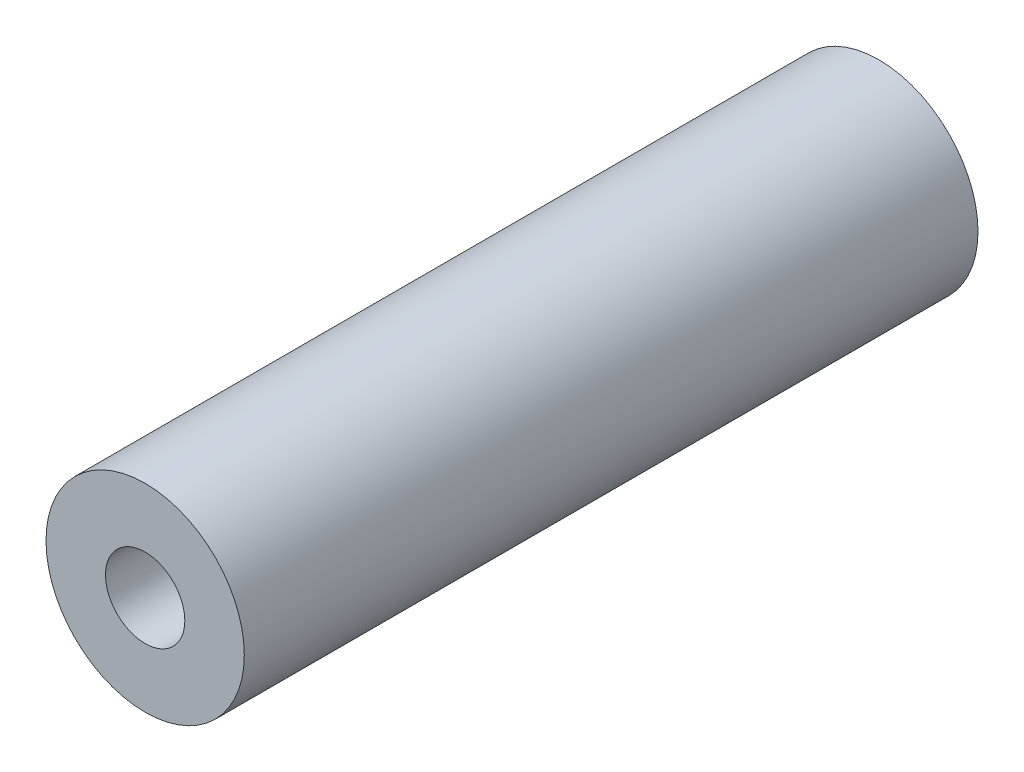
ISO-10303-21;
HEADER;
FILE_DESCRIPTION(('STEP AP214'),'2;1');
FILE_NAME('part.step','',(''),(''),'','','');
FILE_SCHEMA(('AUTOMOTIVE_DESIGN { 1 0 10303 214 1 1 1 1 }'));
ENDSEC;
DATA;
#1=APPLICATION_CONTEXT('core data for automotive mechanical design processes');
#2=APPLICATION_PROTOCOL_DEFINITION('international standard','automotive_design',2000,#1);
#3=PRODUCT_CONTEXT('',#1,'mechanical');
#4=PRODUCT('Part','Part','',(#3));
#5=PRODUCT_RELATED_PRODUCT_CATEGORY('part','',(#4));
#6=PRODUCT_DEFINITION_FORMATION('','',#4);
#7=PRODUCT_DEFINITION_CONTEXT('part definition',#1,'design');
#8=PRODUCT_DEFINITION('design','',#6,#7);
#9=PRODUCT_DEFINITION_SHAPE('','',#8);
#10=(LENGTH_UNIT() NAMED_UNIT(*) SI_UNIT(.MILLI.,.METRE.));
#11=(NAMED_UNIT(*) PLANE_ANGLE_UNIT() SI_UNIT($,.RADIAN.));
#12=(NAMED_UNIT(*) SI_UNIT($,.STERADIAN.) SOLID_ANGLE_UNIT());
#13=UNCERTAINTY_MEASURE_WITH_UNIT(LENGTH_MEASURE(1.E-05),#10,'distance_accuracy_value','');
#14=(GEOMETRIC_REPRESENTATION_CONTEXT(3) GLOBAL_UNCERTAINTY_ASSIGNED_CONTEXT((#13)) GLOBAL_UNIT_ASSIGNED_CONTEXT((#10,
#11,#12)) REPRESENTATION_CONTEXT('',''));
#15=CARTESIAN_POINT('',(0.,0.,0.));
#16=DIRECTION('',(0.,0.,1.));
#17=DIRECTION('',(1.,0.,0.));
#18=AXIS2_PLACEMENT_3D('',#15,#16,#17);
#19=CARTESIAN_POINT('',(0.,0.,37.));
#20=DIRECTION('',(0.,0.,-1.));
#21=DIRECTION('',(-1.,0.,0.));
#22=AXIS2_PLACEMENT_3D('',#19,#20,#21);
#23=CYLINDRICAL_SURFACE('',#22,5.);
#24=CARTESIAN_POINT('',(0.,0.,37.));
#25=DIRECTION('',(0.,0.,1.));
#26=DIRECTION('',(1.,0.,0.));
#27=AXIS2_PLACEMENT_3D('',#24,#25,#26);
#28=CIRCLE('',#27,5.);
#29=CARTESIAN_POINT('',(5.,0.,37.));
#30=VERTEX_POINT('',#29);
#31=EDGE_CURVE('E10',#30,#30,#28,.T.);
#32=ORIENTED_EDGE('',*,*,#31,.F.);
#33=EDGE_LOOP('',(#32));
#34=FACE_BOUND('',#33,.T.);
#35=CARTESIAN_POINT('',(0.,0.,0.));
#36=DIRECTION('',(0.,0.,1.));
#37=DIRECTION('',(1.,0.,0.));
#38=AXIS2_PLACEMENT_3D('',#35,#36,#37);
#39=CIRCLE('',#38,5.);
#40=CARTESIAN_POINT('',(5.,0.,0.));
#41=VERTEX_POINT('',#40);
#42=EDGE_CURVE('E33',#41,#41,#39,.T.);
#43=ORIENTED_EDGE('',*,*,#42,.T.);
#44=EDGE_LOOP('',(#43));
#45=FACE_BOUND('',#44,.T.);
#46=ADVANCED_FACE('F30',(#34,#45),#23,.T.);
#47=CARTESIAN_POINT('',(0.,0.,37.));
#48=DIRECTION('',(0.,0.,1.));
#49=DIRECTION('',(1.,0.,0.));
#50=AXIS2_PLACEMENT_3D('',#47,#48,#49);
#51=PLANE('',#50);
#52=CARTESIAN_POINT('',(0.,0.,37.));
#53=DIRECTION('',(0.,0.,1.));
#54=DIRECTION('',(1.,0.,0.));
#55=AXIS2_PLACEMENT_3D('',#52,#53,#54);
#56=CIRCLE('',#55,2.);
#57=CARTESIAN_POINT('',(2.,0.,37.));
#58=VERTEX_POINT('',#57);
#59=EDGE_CURVE('E42',#58,#58,#56,.T.);
#60=ORIENTED_EDGE('',*,*,#59,.F.);
#61=EDGE_LOOP('',(#60));
#62=FACE_BOUND('',#61,.T.);
#63=ORIENTED_EDGE('',*,*,#31,.T.);
#64=EDGE_LOOP('',(#63));
#65=FACE_BOUND('',#64,.T.);
#66=ADVANCED_FACE('F67',(#62,#65),#51,.T.);
#67=CARTESIAN_POINT('',(0.,0.,0.));
#68=DIRECTION('',(0.,0.,1.));
#69=DIRECTION('',(1.,0.,0.));
#70=AXIS2_PLACEMENT_3D('',#67,#68,#69);
#71=PLANE('',#70);
#72=CARTESIAN_POINT('',(0.,0.,0.));
#73=DIRECTION('',(0.,0.,-1.));
#74=DIRECTION('',(-1.,0.,0.));
#75=AXIS2_PLACEMENT_3D('',#72,#73,#74);
#76=CIRCLE('',#75,2.);
#77=CARTESIAN_POINT('',(-2.,0.,0.));
#78=VERTEX_POINT('',#77);
#79=EDGE_CURVE('E48',#78,#78,#76,.T.);
#80=ORIENTED_EDGE('',*,*,#79,.F.);
#81=EDGE_LOOP('',(#80));
#82=FACE_BOUND('',#81,.T.);
#83=ORIENTED_EDGE('',*,*,#42,.F.);
#84=EDGE_LOOP('',(#83));
#85=FACE_BOUND('',#84,.T.);
#86=ADVANCED_FACE('F63',(#82,#85),#71,.F.);
#87=CARTESIAN_POINT('',(0.,0.,22.));
#88=DIRECTION('',(0.,0.,1.));
#89=DIRECTION('',(1.,0.,0.));
#90=AXIS2_PLACEMENT_3D('',#87,#88,#89);
#91=CYLINDRICAL_SURFACE('',#90,2.);
#92=CARTESIAN_POINT('',(0.,0.,22.));
#93=DIRECTION('',(0.,0.,1.));
#94=DIRECTION('',(1.,0.,0.));
#95=AXIS2_PLACEMENT_3D('',#92,#93,#94);
#96=CIRCLE('',#95,2.);
#97=CARTESIAN_POINT('',(2.,0.,22.));
#98=VERTEX_POINT('',#97);
#99=EDGE_CURVE('E40',#98,#98,#96,.T.);
#100=ORIENTED_EDGE('',*,*,#99,.F.);
#101=EDGE_LOOP('',(#100));
#102=FACE_BOUND('',#101,.T.);
#103=ORIENTED_EDGE('',*,*,#59,.T.);
#104=EDGE_LOOP('',(#103));
#105=FACE_BOUND('',#104,.T.);
#106=ADVANCED_FACE('F66',(#102,#105),#91,.F.);
#107=CARTESIAN_POINT('',(0.,0.,22.));
#108=DIRECTION('',(0.,0.,1.));
#109=DIRECTION('',(1.,0.,0.));
#110=AXIS2_PLACEMENT_3D('',#107,#108,#109);
#111=PLANE('',#110);
#112=ORIENTED_EDGE('',*,*,#99,.T.);
#113=EDGE_LOOP('',(#112));
#114=FACE_BOUND('',#113,.T.);
#115=ADVANCED_FACE('F59',(#114),#111,.T.);
#116=CARTESIAN_POINT('',(0.,0.,15.));
#117=DIRECTION('',(0.,0.,-1.));
#118=DIRECTION('',(-1.,0.,0.));
#119=AXIS2_PLACEMENT_3D('',#116,#117,#118);
#120=CYLINDRICAL_SURFACE('',#119,2.);
#121=CARTESIAN_POINT('',(0.,0.,15.));
#122=DIRECTION('',(0.,0.,-1.));
#123=DIRECTION('',(-1.,0.,0.));
#124=AXIS2_PLACEMENT_3D('',#121,#122,#123);
#125=CIRCLE('',#124,2.);
#126=CARTESIAN_POINT('',(-2.,0.,15.));
#127=VERTEX_POINT('',#126);
#128=EDGE_CURVE('E45',#127,#127,#125,.T.);
#129=ORIENTED_EDGE('',*,*,#128,.F.);
#130=EDGE_LOOP('',(#129));
#131=FACE_BOUND('',#130,.T.);
#132=ORIENTED_EDGE('',*,*,#79,.T.);
#133=EDGE_LOOP('',(#132));
#134=FACE_BOUND('',#133,.T.);
#135=ADVANCED_FACE('F56',(#131,#134),#120,.F.);
#136=CARTESIAN_POINT('',(0.,0.,15.));
#137=DIRECTION('',(0.,0.,-1.));
#138=DIRECTION('',(-1.,0.,0.));
#139=AXIS2_PLACEMENT_3D('',#136,#137,#138);
#140=PLANE('',#139);
#141=ORIENTED_EDGE('',*,*,#128,.T.);
#142=EDGE_LOOP('',(#141));
#143=FACE_BOUND('',#142,.T.);
#144=ADVANCED_FACE('F54',(#143),#140,.T.);
#145=CLOSED_SHELL('',(#46,#66,#86,#106,#115,#135,#144));
#146=MANIFOLD_SOLID_BREP('B2',#145);
#147=ADVANCED_BREP_SHAPE_REPRESENTATION('',(#18,#146),#14);
#148=SHAPE_DEFINITION_REPRESENTATION(#9,#147);
ENDSEC;
END-ISO-10303-21;
